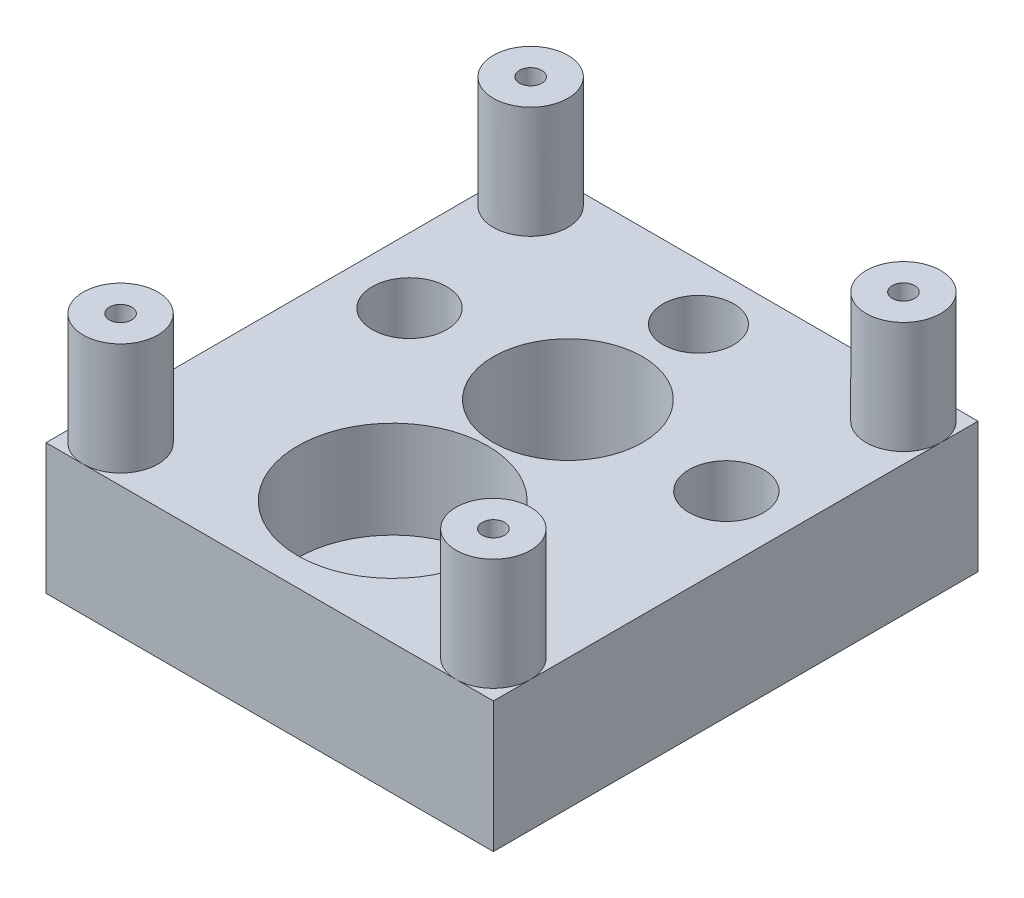
ISO-10303-21;
HEADER;
FILE_DESCRIPTION(('STEP AP214'),'2;1');
FILE_NAME('part.step','',(''),(''),'','','');
FILE_SCHEMA(('AUTOMOTIVE_DESIGN { 1 0 10303 214 1 1 1 1 }'));
ENDSEC;
DATA;
#1=APPLICATION_CONTEXT('core data for automotive mechanical design processes');
#2=APPLICATION_PROTOCOL_DEFINITION('international standard','automotive_design',2000,#1);
#3=PRODUCT_CONTEXT('',#1,'mechanical');
#4=PRODUCT('Part','Part','',(#3));
#5=PRODUCT_RELATED_PRODUCT_CATEGORY('part','',(#4));
#6=PRODUCT_DEFINITION_FORMATION('','',#4);
#7=PRODUCT_DEFINITION_CONTEXT('part definition',#1,'design');
#8=PRODUCT_DEFINITION('design','',#6,#7);
#9=PRODUCT_DEFINITION_SHAPE('','',#8);
#10=(LENGTH_UNIT() NAMED_UNIT(*) SI_UNIT(.MILLI.,.METRE.));
#11=(NAMED_UNIT(*) PLANE_ANGLE_UNIT() SI_UNIT($,.RADIAN.));
#12=(NAMED_UNIT(*) SI_UNIT($,.STERADIAN.) SOLID_ANGLE_UNIT());
#13=UNCERTAINTY_MEASURE_WITH_UNIT(LENGTH_MEASURE(1.E-05),#10,'distance_accuracy_value','');
#14=(GEOMETRIC_REPRESENTATION_CONTEXT(3) GLOBAL_UNCERTAINTY_ASSIGNED_CONTEXT((#13)) GLOBAL_UNIT_ASSIGNED_CONTEXT((#10,
#11,#12)) REPRESENTATION_CONTEXT('',''));
#15=CARTESIAN_POINT('',(0.,0.,0.));
#16=DIRECTION('',(0.,0.,1.));
#17=DIRECTION('',(1.,0.,0.));
#18=AXIS2_PLACEMENT_3D('',#15,#16,#17);
#19=CARTESIAN_POINT('',(0.,3.5,0.));
#20=DIRECTION('',(0.,1.,0.));
#21=DIRECTION('',(0.,0.,1.));
#22=AXIS2_PLACEMENT_3D('',#19,#20,#21);
#23=PLANE('',#22);
#24=CARTESIAN_POINT('',(0.,3.5,0.));
#25=DIRECTION('',(0.,1.,0.));
#26=DIRECTION('',(0.,0.,1.));
#27=AXIS2_PLACEMENT_3D('',#24,#25,#26);
#28=CIRCLE('',#27,2.);
#29=CARTESIAN_POINT('',(0.,3.5,2.));
#30=VERTEX_POINT('',#29);
#31=EDGE_CURVE('E204',#30,#30,#28,.T.);
#32=ORIENTED_EDGE('',*,*,#31,.F.);
#33=EDGE_LOOP('',(#32));
#34=FACE_BOUND('',#33,.T.);
#35=CARTESIAN_POINT('',(4.25,3.5,0.));
#36=DIRECTION('',(0.,1.,0.));
#37=DIRECTION('',(0.,0.,1.));
#38=AXIS2_PLACEMENT_3D('',#35,#36,#37);
#39=CIRCLE('',#38,1.);
#40=CARTESIAN_POINT('',(4.25,3.5,1.));
#41=VERTEX_POINT('',#40);
#42=EDGE_CURVE('E308',#41,#41,#39,.T.);
#43=ORIENTED_EDGE('',*,*,#42,.F.);
#44=EDGE_LOOP('',(#43));
#45=FACE_BOUND('',#44,.T.);
#46=CARTESIAN_POINT('',(0.,3.5,-3.5));
#47=DIRECTION('',(0.,1.,0.));
#48=DIRECTION('',(0.,0.,1.));
#49=AXIS2_PLACEMENT_3D('',#46,#47,#48);
#50=CIRCLE('',#49,0.95);
#51=CARTESIAN_POINT('',(0.,3.5,-2.55));
#52=VERTEX_POINT('',#51);
#53=EDGE_CURVE('E303',#52,#52,#50,.T.);
#54=ORIENTED_EDGE('',*,*,#53,.F.);
#55=EDGE_LOOP('',(#54));
#56=FACE_BOUND('',#55,.T.);
#57=CARTESIAN_POINT('',(-4.25,3.5,0.));
#58=DIRECTION('',(0.,1.,0.));
#59=DIRECTION('',(0.,0.,1.));
#60=AXIS2_PLACEMENT_3D('',#57,#58,#59);
#61=CIRCLE('',#60,1.);
#62=CARTESIAN_POINT('',(-4.25,3.5,1.));
#63=VERTEX_POINT('',#62);
#64=EDGE_CURVE('E300',#63,#63,#61,.T.);
#65=ORIENTED_EDGE('',*,*,#64,.F.);
#66=EDGE_LOOP('',(#65));
#67=FACE_BOUND('',#66,.T.);
#68=CARTESIAN_POINT('',(0.,3.5,4.7));
#69=DIRECTION('',(0.,1.,0.));
#70=DIRECTION('',(0.,0.,1.));
#71=AXIS2_PLACEMENT_3D('',#68,#69,#70);
#72=CIRCLE('',#71,2.55);
#73=CARTESIAN_POINT('',(0.,3.5,7.25));
#74=VERTEX_POINT('',#73);
#75=EDGE_CURVE('E291',#74,#74,#72,.T.);
#76=ORIENTED_EDGE('',*,*,#75,.F.);
#77=EDGE_LOOP('',(#76));
#78=FACE_BOUND('',#77,.T.);
#79=DIRECTION('',(1.,0.,0.));
#80=VECTOR('',#79,1.);
#81=CARTESIAN_POINT('',(-6.,3.5,8.));
#82=LINE('',#81,#80);
#83=CARTESIAN_POINT('',(-5.,3.5,8.));
#84=VERTEX_POINT('',#83);
#85=CARTESIAN_POINT('',(5.,3.5,8.));
#86=VERTEX_POINT('',#85);
#87=EDGE_CURVE('E176',#84,#86,#82,.T.);
#88=ORIENTED_EDGE('',*,*,#87,.T.);
#89=CARTESIAN_POINT('',(5.,3.5,7.));
#90=DIRECTION('',(0.,1.,0.));
#91=DIRECTION('',(0.,0.,1.));
#92=AXIS2_PLACEMENT_3D('',#89,#90,#91);
#93=CIRCLE('',#92,1.);
#94=CARTESIAN_POINT('',(6.,3.5,7.));
#95=VERTEX_POINT('',#94);
#96=EDGE_CURVE('E112',#95,#86,#93,.T.);
#97=ORIENTED_EDGE('',*,*,#96,.F.);
#98=DIRECTION('',(0.,0.,1.));
#99=VECTOR('',#98,1.);
#100=CARTESIAN_POINT('',(6.,3.5,-5.));
#101=LINE('',#100,#99);
#102=CARTESIAN_POINT('',(6.,3.5,-4.));
#103=VERTEX_POINT('',#102);
#104=EDGE_CURVE('E172',#103,#95,#101,.T.);
#105=ORIENTED_EDGE('',*,*,#104,.F.);
#106=CARTESIAN_POINT('',(5.,3.5,-4.));
#107=DIRECTION('',(0.,1.,0.));
#108=DIRECTION('',(0.,0.,1.));
#109=AXIS2_PLACEMENT_3D('',#106,#107,#108);
#110=CIRCLE('',#109,1.);
#111=CARTESIAN_POINT('',(5.,3.5,-5.));
#112=VERTEX_POINT('',#111);
#113=EDGE_CURVE('E281',#112,#103,#110,.T.);
#114=ORIENTED_EDGE('',*,*,#113,.F.);
#115=DIRECTION('',(1.,0.,0.));
#116=VECTOR('',#115,1.);
#117=CARTESIAN_POINT('',(-6.,3.5,-5.));
#118=LINE('',#117,#116);
#119=CARTESIAN_POINT('',(-5.,3.5,-5.));
#120=VERTEX_POINT('',#119);
#121=EDGE_CURVE('E199',#120,#112,#118,.T.);
#122=ORIENTED_EDGE('',*,*,#121,.F.);
#123=CARTESIAN_POINT('',(-5.,3.5,-4.));
#124=DIRECTION('',(0.,1.,0.));
#125=DIRECTION('',(0.,0.,1.));
#126=AXIS2_PLACEMENT_3D('',#123,#124,#125);
#127=CIRCLE('',#126,1.);
#128=CARTESIAN_POINT('',(-6.,3.5,-4.));
#129=VERTEX_POINT('',#128);
#130=EDGE_CURVE('E671',#129,#120,#127,.T.);
#131=ORIENTED_EDGE('',*,*,#130,.F.);
#132=DIRECTION('',(0.,0.,1.));
#133=VECTOR('',#132,1.);
#134=CARTESIAN_POINT('',(-6.,3.5,-5.));
#135=LINE('',#134,#133);
#136=CARTESIAN_POINT('',(-6.,3.5,7.));
#137=VERTEX_POINT('',#136);
#138=EDGE_CURVE('E252',#129,#137,#135,.T.);
#139=ORIENTED_EDGE('',*,*,#138,.T.);
#140=CARTESIAN_POINT('',(-5.,3.5,7.));
#141=DIRECTION('',(0.,1.,0.));
#142=DIRECTION('',(0.,0.,1.));
#143=AXIS2_PLACEMENT_3D('',#140,#141,#142);
#144=CIRCLE('',#143,1.);
#145=EDGE_CURVE('E106',#84,#137,#144,.T.);
#146=ORIENTED_EDGE('',*,*,#145,.F.);
#147=EDGE_LOOP('',(#88,#97,#105,#114,#122,#131,#139,#146));
#148=FACE_BOUND('',#147,.T.);
#149=ADVANCED_FACE('F95',(#34,#45,#56,#67,#78,#148),#23,.T.);
#150=CARTESIAN_POINT('',(-6.,3.5,-5.));
#151=VERTEX_POINT('',#150);
#152=EDGE_CURVE('E250',#151,#129,#135,.T.);
#153=ORIENTED_EDGE('',*,*,#152,.T.);
#154=EDGE_CURVE('E119',#120,#129,#127,.T.);
#155=ORIENTED_EDGE('',*,*,#154,.F.);
#156=EDGE_CURVE('E195',#151,#120,#118,.T.);
#157=ORIENTED_EDGE('',*,*,#156,.F.);
#158=EDGE_LOOP('',(#153,#155,#157));
#159=FACE_BOUND('',#158,.T.);
#160=ADVANCED_FACE('F332',(#159),#23,.T.);
#161=CARTESIAN_POINT('',(6.,3.5,-5.));
#162=VERTEX_POINT('',#161);
#163=EDGE_CURVE('E191',#112,#162,#118,.T.);
#164=ORIENTED_EDGE('',*,*,#163,.F.);
#165=EDGE_CURVE('E279',#103,#112,#110,.T.);
#166=ORIENTED_EDGE('',*,*,#165,.F.);
#167=EDGE_CURVE('E186',#162,#103,#101,.T.);
#168=ORIENTED_EDGE('',*,*,#167,.F.);
#169=EDGE_LOOP('',(#164,#166,#168));
#170=FACE_BOUND('',#169,.T.);
#171=ADVANCED_FACE('F277',(#170),#23,.T.);
#172=CARTESIAN_POINT('',(6.,3.5,8.));
#173=VERTEX_POINT('',#172);
#174=EDGE_CURVE('E179',#95,#173,#101,.T.);
#175=ORIENTED_EDGE('',*,*,#174,.F.);
#176=EDGE_CURVE('E160',#86,#95,#93,.T.);
#177=ORIENTED_EDGE('',*,*,#176,.F.);
#178=EDGE_CURVE('E181',#86,#173,#82,.T.);
#179=ORIENTED_EDGE('',*,*,#178,.T.);
#180=EDGE_LOOP('',(#175,#177,#179));
#181=FACE_BOUND('',#180,.T.);
#182=ADVANCED_FACE('F180',(#181),#23,.T.);
#183=CARTESIAN_POINT('',(-4.25,3.5,0.));
#184=DIRECTION('',(0.,-1.,0.));
#185=DIRECTION('',(0.,0.,-1.));
#186=AXIS2_PLACEMENT_3D('',#183,#184,#185);
#187=CYLINDRICAL_SURFACE('',#186,0.8);
#188=CARTESIAN_POINT('',(-4.25,0.,0.));
#189=DIRECTION('',(0.,1.,0.));
#190=DIRECTION('',(0.,0.,1.));
#191=AXIS2_PLACEMENT_3D('',#188,#189,#190);
#192=CIRCLE('',#191,0.8);
#193=CARTESIAN_POINT('',(-4.25,0.,0.8));
#194=VERTEX_POINT('',#193);
#195=EDGE_CURVE('E238',#194,#194,#192,.T.);
#196=ORIENTED_EDGE('',*,*,#195,.F.);
#197=EDGE_LOOP('',(#196));
#198=FACE_BOUND('',#197,.T.);
#199=CARTESIAN_POINT('',(-4.25,2.,0.));
#200=DIRECTION('',(0.,1.,0.));
#201=DIRECTION('',(0.,0.,1.));
#202=AXIS2_PLACEMENT_3D('',#199,#200,#201);
#203=CIRCLE('',#202,0.8);
#204=CARTESIAN_POINT('',(-4.25,2.,0.8));
#205=VERTEX_POINT('',#204);
#206=EDGE_CURVE('E99',#205,#205,#203,.T.);
#207=ORIENTED_EDGE('',*,*,#206,.T.);
#208=EDGE_LOOP('',(#207));
#209=FACE_BOUND('',#208,.T.);
#210=ADVANCED_FACE('F352',(#198,#209),#187,.F.);
#211=CARTESIAN_POINT('',(4.25,3.5,0.));
#212=DIRECTION('',(0.,-1.,0.));
#213=DIRECTION('',(0.,0.,-1.));
#214=AXIS2_PLACEMENT_3D('',#211,#212,#213);
#215=CYLINDRICAL_SURFACE('',#214,0.800000000000001);
#216=CARTESIAN_POINT('',(4.25,0.,0.));
#217=DIRECTION('',(0.,1.,0.));
#218=DIRECTION('',(0.,0.,1.));
#219=AXIS2_PLACEMENT_3D('',#216,#217,#218);
#220=CIRCLE('',#219,0.800000000000001);
#221=CARTESIAN_POINT('',(4.25,0.,0.800000000000001));
#222=VERTEX_POINT('',#221);
#223=EDGE_CURVE('E233',#222,#222,#220,.T.);
#224=ORIENTED_EDGE('',*,*,#223,.F.);
#225=EDGE_LOOP('',(#224));
#226=FACE_BOUND('',#225,.T.);
#227=CARTESIAN_POINT('',(4.25,2.,0.));
#228=DIRECTION('',(0.,1.,0.));
#229=DIRECTION('',(0.,0.,1.));
#230=AXIS2_PLACEMENT_3D('',#227,#228,#229);
#231=CIRCLE('',#230,0.800000000000001);
#232=CARTESIAN_POINT('',(4.25,2.,0.800000000000001));
#233=VERTEX_POINT('',#232);
#234=EDGE_CURVE('E223',#233,#233,#231,.T.);
#235=ORIENTED_EDGE('',*,*,#234,.T.);
#236=EDGE_LOOP('',(#235));
#237=FACE_BOUND('',#236,.T.);
#238=ADVANCED_FACE('F348',(#226,#237),#215,.F.);
#239=CARTESIAN_POINT('',(0.,3.5,-3.5));
#240=DIRECTION('',(0.,-1.,0.));
#241=DIRECTION('',(0.,0.,-1.));
#242=AXIS2_PLACEMENT_3D('',#239,#240,#241);
#243=CYLINDRICAL_SURFACE('',#242,0.7);
#244=CARTESIAN_POINT('',(0.,0.,-3.5));
#245=DIRECTION('',(0.,1.,0.));
#246=DIRECTION('',(0.,0.,1.));
#247=AXIS2_PLACEMENT_3D('',#244,#245,#246);
#248=CIRCLE('',#247,0.7);
#249=CARTESIAN_POINT('',(0.,0.,-2.8));
#250=VERTEX_POINT('',#249);
#251=EDGE_CURVE('E229',#250,#250,#248,.T.);
#252=ORIENTED_EDGE('',*,*,#251,.F.);
#253=EDGE_LOOP('',(#252));
#254=FACE_BOUND('',#253,.T.);
#255=CARTESIAN_POINT('',(0.,2.,-3.5));
#256=DIRECTION('',(0.,1.,0.));
#257=DIRECTION('',(0.,0.,1.));
#258=AXIS2_PLACEMENT_3D('',#255,#256,#257);
#259=CIRCLE('',#258,0.7);
#260=CARTESIAN_POINT('',(0.,2.,-2.8));
#261=VERTEX_POINT('',#260);
#262=EDGE_CURVE('E221',#261,#261,#259,.T.);
#263=ORIENTED_EDGE('',*,*,#262,.T.);
#264=EDGE_LOOP('',(#263));
#265=FACE_BOUND('',#264,.T.);
#266=ADVANCED_FACE('F343',(#254,#265),#243,.F.);
#267=EDGE_CURVE('E12',#137,#84,#144,.T.);
#268=ORIENTED_EDGE('',*,*,#267,.F.);
#269=CARTESIAN_POINT('',(-6.,3.5,8.));
#270=VERTEX_POINT('',#269);
#271=EDGE_CURVE('E213',#137,#270,#135,.T.);
#272=ORIENTED_EDGE('',*,*,#271,.T.);
#273=EDGE_CURVE('E184',#270,#84,#82,.T.);
#274=ORIENTED_EDGE('',*,*,#273,.T.);
#275=EDGE_LOOP('',(#268,#272,#274));
#276=FACE_BOUND('',#275,.T.);
#277=ADVANCED_FACE('F260',(#276),#23,.T.);
#278=CARTESIAN_POINT('',(0.,0.,0.));
#279=DIRECTION('',(0.,1.,0.));
#280=DIRECTION('',(0.,0.,1.));
#281=AXIS2_PLACEMENT_3D('',#278,#279,#280);
#282=PLANE('',#281);
#283=DIRECTION('',(0.,0.,1.));
#284=VECTOR('',#283,1.);
#285=CARTESIAN_POINT('',(-6.,0.,-5.));
#286=LINE('',#285,#284);
#287=CARTESIAN_POINT('',(-6.,0.,-5.));
#288=VERTEX_POINT('',#287);
#289=CARTESIAN_POINT('',(-6.,0.,8.));
#290=VERTEX_POINT('',#289);
#291=EDGE_CURVE('E200',#288,#290,#286,.T.);
#292=ORIENTED_EDGE('',*,*,#291,.F.);
#293=DIRECTION('',(1.,0.,0.));
#294=VECTOR('',#293,1.);
#295=CARTESIAN_POINT('',(-6.,0.,-5.));
#296=LINE('',#295,#294);
#297=CARTESIAN_POINT('',(6.,0.,-5.));
#298=VERTEX_POINT('',#297);
#299=EDGE_CURVE('E210',#288,#298,#296,.T.);
#300=ORIENTED_EDGE('',*,*,#299,.T.);
#301=DIRECTION('',(0.,0.,1.));
#302=VECTOR('',#301,1.);
#303=CARTESIAN_POINT('',(6.,0.,-5.));
#304=LINE('',#303,#302);
#305=CARTESIAN_POINT('',(6.,0.,8.));
#306=VERTEX_POINT('',#305);
#307=EDGE_CURVE('E207',#298,#306,#304,.T.);
#308=ORIENTED_EDGE('',*,*,#307,.T.);
#309=DIRECTION('',(1.,0.,0.));
#310=VECTOR('',#309,1.);
#311=CARTESIAN_POINT('',(-6.,0.,8.));
#312=LINE('',#311,#310);
#313=EDGE_CURVE('E203',#290,#306,#312,.T.);
#314=ORIENTED_EDGE('',*,*,#313,.F.);
#315=EDGE_LOOP('',(#292,#300,#308,#314));
#316=FACE_BOUND('',#315,.T.);
#317=CARTESIAN_POINT('',(0.,0.,0.));
#318=DIRECTION('',(0.,1.,0.));
#319=DIRECTION('',(0.,0.,1.));
#320=AXIS2_PLACEMENT_3D('',#317,#318,#319);
#321=CIRCLE('',#320,2.);
#322=CARTESIAN_POINT('',(0.,0.,2.));
#323=VERTEX_POINT('',#322);
#324=EDGE_CURVE('E246',#323,#323,#321,.T.);
#325=ORIENTED_EDGE('',*,*,#324,.T.);
#326=EDGE_LOOP('',(#325));
#327=FACE_BOUND('',#326,.T.);
#328=ORIENTED_EDGE('',*,*,#195,.T.);
#329=EDGE_LOOP('',(#328));
#330=FACE_BOUND('',#329,.T.);
#331=ORIENTED_EDGE('',*,*,#223,.T.);
#332=EDGE_LOOP('',(#331));
#333=FACE_BOUND('',#332,.T.);
#334=ORIENTED_EDGE('',*,*,#251,.T.);
#335=EDGE_LOOP('',(#334));
#336=FACE_BOUND('',#335,.T.);
#337=ADVANCED_FACE('F270',(#316,#327,#330,#333,#336),#282,.F.);
#338=CARTESIAN_POINT('',(-6.,3.5,-5.));
#339=DIRECTION('',(1.,0.,0.));
#340=DIRECTION('',(0.,0.,-1.));
#341=AXIS2_PLACEMENT_3D('',#338,#339,#340);
#342=PLANE('',#341);
#343=ORIENTED_EDGE('',*,*,#291,.T.);
#344=DIRECTION('',(0.,-1.,0.));
#345=VECTOR('',#344,1.);
#346=CARTESIAN_POINT('',(-6.,3.5,8.));
#347=LINE('',#346,#345);
#348=EDGE_CURVE('E104',#270,#290,#347,.T.);
#349=ORIENTED_EDGE('',*,*,#348,.F.);
#350=ORIENTED_EDGE('',*,*,#271,.F.);
#351=ORIENTED_EDGE('',*,*,#138,.F.);
#352=ORIENTED_EDGE('',*,*,#152,.F.);
#353=DIRECTION('',(0.,-1.,0.));
#354=VECTOR('',#353,1.);
#355=CARTESIAN_POINT('',(-6.,3.5,-5.));
#356=LINE('',#355,#354);
#357=EDGE_CURVE('E198',#151,#288,#356,.T.);
#358=ORIENTED_EDGE('',*,*,#357,.T.);
#359=EDGE_LOOP('',(#343,#349,#350,#351,#352,#358));
#360=FACE_BOUND('',#359,.T.);
#361=ADVANCED_FACE('F97',(#360),#342,.F.);
#362=CARTESIAN_POINT('',(-6.,3.5,8.));
#363=DIRECTION('',(0.,0.,-1.));
#364=DIRECTION('',(-1.,0.,0.));
#365=AXIS2_PLACEMENT_3D('',#362,#363,#364);
#366=PLANE('',#365);
#367=ORIENTED_EDGE('',*,*,#313,.T.);
#368=DIRECTION('',(0.,-1.,0.));
#369=VECTOR('',#368,1.);
#370=CARTESIAN_POINT('',(6.,3.5,8.));
#371=LINE('',#370,#369);
#372=EDGE_CURVE('E217',#173,#306,#371,.T.);
#373=ORIENTED_EDGE('',*,*,#372,.F.);
#374=ORIENTED_EDGE('',*,*,#178,.F.);
#375=ORIENTED_EDGE('',*,*,#87,.F.);
#376=ORIENTED_EDGE('',*,*,#273,.F.);
#377=ORIENTED_EDGE('',*,*,#348,.T.);
#378=EDGE_LOOP('',(#367,#373,#374,#375,#376,#377));
#379=FACE_BOUND('',#378,.T.);
#380=ADVANCED_FACE('F266',(#379),#366,.F.);
#381=CARTESIAN_POINT('',(6.,3.5,-5.));
#382=DIRECTION('',(1.,0.,0.));
#383=DIRECTION('',(0.,0.,-1.));
#384=AXIS2_PLACEMENT_3D('',#381,#382,#383);
#385=PLANE('',#384);
#386=ORIENTED_EDGE('',*,*,#307,.F.);
#387=DIRECTION('',(0.,-1.,0.));
#388=VECTOR('',#387,1.);
#389=CARTESIAN_POINT('',(6.,3.5,-5.));
#390=LINE('',#389,#388);
#391=EDGE_CURVE('E215',#162,#298,#390,.T.);
#392=ORIENTED_EDGE('',*,*,#391,.F.);
#393=ORIENTED_EDGE('',*,*,#167,.T.);
#394=ORIENTED_EDGE('',*,*,#104,.T.);
#395=ORIENTED_EDGE('',*,*,#174,.T.);
#396=ORIENTED_EDGE('',*,*,#372,.T.);
#397=EDGE_LOOP('',(#386,#392,#393,#394,#395,#396));
#398=FACE_BOUND('',#397,.T.);
#399=ADVANCED_FACE('F188',(#398),#385,.T.);
#400=CARTESIAN_POINT('',(-6.,3.5,-5.));
#401=DIRECTION('',(0.,0.,-1.));
#402=DIRECTION('',(-1.,0.,0.));
#403=AXIS2_PLACEMENT_3D('',#400,#401,#402);
#404=PLANE('',#403);
#405=ORIENTED_EDGE('',*,*,#299,.F.);
#406=ORIENTED_EDGE('',*,*,#357,.F.);
#407=ORIENTED_EDGE('',*,*,#156,.T.);
#408=ORIENTED_EDGE('',*,*,#121,.T.);
#409=ORIENTED_EDGE('',*,*,#163,.T.);
#410=ORIENTED_EDGE('',*,*,#391,.T.);
#411=EDGE_LOOP('',(#405,#406,#407,#408,#409,#410));
#412=FACE_BOUND('',#411,.T.);
#413=ADVANCED_FACE('F273',(#412),#404,.T.);
#414=CARTESIAN_POINT('',(0.,3.5,0.));
#415=DIRECTION('',(0.,-1.,0.));
#416=DIRECTION('',(0.,0.,-1.));
#417=AXIS2_PLACEMENT_3D('',#414,#415,#416);
#418=CYLINDRICAL_SURFACE('',#417,2.);
#419=ORIENTED_EDGE('',*,*,#31,.T.);
#420=EDGE_LOOP('',(#419));
#421=FACE_BOUND('',#420,.T.);
#422=ORIENTED_EDGE('',*,*,#324,.F.);
#423=EDGE_LOOP('',(#422));
#424=FACE_BOUND('',#423,.T.);
#425=ADVANCED_FACE('F437',(#421,#424),#418,.F.);
#426=CARTESIAN_POINT('',(0.,2.,-3.5));
#427=DIRECTION('',(0.,1.,0.));
#428=DIRECTION('',(0.,0.,1.));
#429=AXIS2_PLACEMENT_3D('',#426,#427,#428);
#430=CYLINDRICAL_SURFACE('',#429,0.95);
#431=CARTESIAN_POINT('',(0.,2.,-3.5));
#432=DIRECTION('',(0.,1.,0.));
#433=DIRECTION('',(0.,0.,1.));
#434=AXIS2_PLACEMENT_3D('',#431,#432,#433);
#435=CIRCLE('',#434,0.95);
#436=CARTESIAN_POINT('',(0.,2.,-2.55));
#437=VERTEX_POINT('',#436);
#438=EDGE_CURVE('E306',#437,#437,#435,.T.);
#439=ORIENTED_EDGE('',*,*,#438,.F.);
#440=EDGE_LOOP('',(#439));
#441=FACE_BOUND('',#440,.T.);
#442=ORIENTED_EDGE('',*,*,#53,.T.);
#443=EDGE_LOOP('',(#442));
#444=FACE_BOUND('',#443,.T.);
#445=ADVANCED_FACE('F328',(#441,#444),#430,.F.);
#446=CARTESIAN_POINT('',(0.,2.,-3.5));
#447=DIRECTION('',(0.,1.,0.));
#448=DIRECTION('',(0.,0.,1.));
#449=AXIS2_PLACEMENT_3D('',#446,#447,#448);
#450=PLANE('',#449);
#451=ORIENTED_EDGE('',*,*,#262,.F.);
#452=EDGE_LOOP('',(#451));
#453=FACE_BOUND('',#452,.T.);
#454=ORIENTED_EDGE('',*,*,#438,.T.);
#455=EDGE_LOOP('',(#454));
#456=FACE_BOUND('',#455,.T.);
#457=ADVANCED_FACE('F319',(#453,#456),#450,.T.);
#458=CARTESIAN_POINT('',(4.25,2.,0.));
#459=DIRECTION('',(0.,1.,0.));
#460=DIRECTION('',(0.,0.,1.));
#461=AXIS2_PLACEMENT_3D('',#458,#459,#460);
#462=CYLINDRICAL_SURFACE('',#461,1.);
#463=CARTESIAN_POINT('',(4.25,2.,0.));
#464=DIRECTION('',(0.,1.,0.));
#465=DIRECTION('',(0.,0.,1.));
#466=AXIS2_PLACEMENT_3D('',#463,#464,#465);
#467=CIRCLE('',#466,1.);
#468=CARTESIAN_POINT('',(4.25,2.,1.));
#469=VERTEX_POINT('',#468);
#470=EDGE_CURVE('E241',#469,#469,#467,.T.);
#471=ORIENTED_EDGE('',*,*,#470,.F.);
#472=EDGE_LOOP('',(#471));
#473=FACE_BOUND('',#472,.T.);
#474=ORIENTED_EDGE('',*,*,#42,.T.);
#475=EDGE_LOOP('',(#474));
#476=FACE_BOUND('',#475,.T.);
#477=ADVANCED_FACE('F317',(#473,#476),#462,.F.);
#478=CARTESIAN_POINT('',(4.25,2.,0.));
#479=DIRECTION('',(0.,1.,0.));
#480=DIRECTION('',(0.,0.,1.));
#481=AXIS2_PLACEMENT_3D('',#478,#479,#480);
#482=PLANE('',#481);
#483=ORIENTED_EDGE('',*,*,#234,.F.);
#484=EDGE_LOOP('',(#483));
#485=FACE_BOUND('',#484,.T.);
#486=ORIENTED_EDGE('',*,*,#470,.T.);
#487=EDGE_LOOP('',(#486));
#488=FACE_BOUND('',#487,.T.);
#489=ADVANCED_FACE('F315',(#485,#488),#482,.T.);
#490=CARTESIAN_POINT('',(-4.25,2.,0.));
#491=DIRECTION('',(0.,1.,0.));
#492=DIRECTION('',(0.,0.,1.));
#493=AXIS2_PLACEMENT_3D('',#490,#491,#492);
#494=CYLINDRICAL_SURFACE('',#493,1.);
#495=CARTESIAN_POINT('',(-4.25,2.,0.));
#496=DIRECTION('',(0.,1.,0.));
#497=DIRECTION('',(0.,0.,1.));
#498=AXIS2_PLACEMENT_3D('',#495,#496,#497);
#499=CIRCLE('',#498,1.);
#500=CARTESIAN_POINT('',(-4.25,2.,1.));
#501=VERTEX_POINT('',#500);
#502=EDGE_CURVE('E224',#501,#501,#499,.T.);
#503=ORIENTED_EDGE('',*,*,#502,.F.);
#504=EDGE_LOOP('',(#503));
#505=FACE_BOUND('',#504,.T.);
#506=ORIENTED_EDGE('',*,*,#64,.T.);
#507=EDGE_LOOP('',(#506));
#508=FACE_BOUND('',#507,.T.);
#509=ADVANCED_FACE('F325',(#505,#508),#494,.F.);
#510=CARTESIAN_POINT('',(-4.25,2.,0.));
#511=DIRECTION('',(0.,1.,0.));
#512=DIRECTION('',(0.,0.,1.));
#513=AXIS2_PLACEMENT_3D('',#510,#511,#512);
#514=PLANE('',#513);
#515=ORIENTED_EDGE('',*,*,#206,.F.);
#516=EDGE_LOOP('',(#515));
#517=FACE_BOUND('',#516,.T.);
#518=ORIENTED_EDGE('',*,*,#502,.T.);
#519=EDGE_LOOP('',(#518));
#520=FACE_BOUND('',#519,.T.);
#521=ADVANCED_FACE('F393',(#517,#520),#514,.T.);
#522=CARTESIAN_POINT('',(0.,0.9,4.7));
#523=DIRECTION('',(0.,1.,0.));
#524=DIRECTION('',(0.,0.,1.));
#525=AXIS2_PLACEMENT_3D('',#522,#523,#524);
#526=CYLINDRICAL_SURFACE('',#525,2.55);
#527=CARTESIAN_POINT('',(0.,0.9,4.7));
#528=DIRECTION('',(0.,1.,0.));
#529=DIRECTION('',(0.,0.,1.));
#530=AXIS2_PLACEMENT_3D('',#527,#528,#529);
#531=CIRCLE('',#530,2.55);
#532=CARTESIAN_POINT('',(0.,0.9,7.25));
#533=VERTEX_POINT('',#532);
#534=EDGE_CURVE('E293',#533,#533,#531,.T.);
#535=ORIENTED_EDGE('',*,*,#534,.F.);
#536=EDGE_LOOP('',(#535));
#537=FACE_BOUND('',#536,.T.);
#538=ORIENTED_EDGE('',*,*,#75,.T.);
#539=EDGE_LOOP('',(#538));
#540=FACE_BOUND('',#539,.T.);
#541=ADVANCED_FACE('F381',(#537,#540),#526,.F.);
#542=CARTESIAN_POINT('',(0.,0.9,4.7));
#543=DIRECTION('',(0.,1.,0.));
#544=DIRECTION('',(0.,0.,1.));
#545=AXIS2_PLACEMENT_3D('',#542,#543,#544);
#546=PLANE('',#545);
#547=ORIENTED_EDGE('',*,*,#534,.T.);
#548=EDGE_LOOP('',(#547));
#549=FACE_BOUND('',#548,.T.);
#550=ADVANCED_FACE('F375',(#549),#546,.T.);
#551=CARTESIAN_POINT('',(-5.,6.5,7.));
#552=DIRECTION('',(0.,-1.,0.));
#553=DIRECTION('',(0.,0.,-1.));
#554=AXIS2_PLACEMENT_3D('',#551,#552,#553);
#555=CYLINDRICAL_SURFACE('',#554,1.);
#556=CARTESIAN_POINT('',(-5.,6.5,7.));
#557=DIRECTION('',(0.,1.,0.));
#558=DIRECTION('',(0.,0.,1.));
#559=AXIS2_PLACEMENT_3D('',#556,#557,#558);
#560=CIRCLE('',#559,1.);
#561=CARTESIAN_POINT('',(-5.,6.5,8.));
#562=VERTEX_POINT('',#561);
#563=EDGE_CURVE('E283',#562,#562,#560,.T.);
#564=ORIENTED_EDGE('',*,*,#563,.F.);
#565=EDGE_LOOP('',(#564));
#566=FACE_BOUND('',#565,.T.);
#567=ORIENTED_EDGE('',*,*,#145,.T.);
#568=ORIENTED_EDGE('',*,*,#267,.T.);
#569=EDGE_LOOP('',(#567,#568));
#570=FACE_BOUND('',#569,.T.);
#571=ADVANCED_FACE('F380',(#566,#570),#555,.T.);
#572=CARTESIAN_POINT('',(-5.,6.5,7.));
#573=DIRECTION('',(0.,1.,0.));
#574=DIRECTION('',(0.,0.,1.));
#575=AXIS2_PLACEMENT_3D('',#572,#573,#574);
#576=PLANE('',#575);
#577=CARTESIAN_POINT('',(-5.,6.5,7.));
#578=DIRECTION('',(0.,1.,0.));
#579=DIRECTION('',(0.,0.,1.));
#580=AXIS2_PLACEMENT_3D('',#577,#578,#579);
#581=CIRCLE('',#580,0.3);
#582=CARTESIAN_POINT('',(-5.,6.5,7.3));
#583=VERTEX_POINT('',#582);
#584=EDGE_CURVE('E661',#583,#583,#581,.T.);
#585=ORIENTED_EDGE('',*,*,#584,.F.);
#586=EDGE_LOOP('',(#585));
#587=FACE_BOUND('',#586,.T.);
#588=ORIENTED_EDGE('',*,*,#563,.T.);
#589=EDGE_LOOP('',(#588));
#590=FACE_BOUND('',#589,.T.);
#591=ADVANCED_FACE('F505',(#587,#590),#576,.T.);
#592=CARTESIAN_POINT('',(5.,6.5,-4.));
#593=DIRECTION('',(0.,-1.,0.));
#594=DIRECTION('',(0.,0.,-1.));
#595=AXIS2_PLACEMENT_3D('',#592,#593,#594);
#596=CYLINDRICAL_SURFACE('',#595,1.);
#597=CARTESIAN_POINT('',(5.,6.5,-4.));
#598=DIRECTION('',(0.,1.,0.));
#599=DIRECTION('',(0.,0.,1.));
#600=AXIS2_PLACEMENT_3D('',#597,#598,#599);
#601=CIRCLE('',#600,1.);
#602=CARTESIAN_POINT('',(5.,6.5,-3.));
#603=VERTEX_POINT('',#602);
#604=EDGE_CURVE('E284',#603,#603,#601,.T.);
#605=ORIENTED_EDGE('',*,*,#604,.F.);
#606=EDGE_LOOP('',(#605));
#607=FACE_BOUND('',#606,.T.);
#608=ORIENTED_EDGE('',*,*,#165,.T.);
#609=ORIENTED_EDGE('',*,*,#113,.T.);
#610=EDGE_LOOP('',(#608,#609));
#611=FACE_BOUND('',#610,.T.);
#612=ADVANCED_FACE('F513',(#607,#611),#596,.T.);
#613=CARTESIAN_POINT('',(5.,6.5,-4.));
#614=DIRECTION('',(0.,1.,0.));
#615=DIRECTION('',(0.,0.,1.));
#616=AXIS2_PLACEMENT_3D('',#613,#614,#615);
#617=PLANE('',#616);
#618=CARTESIAN_POINT('',(5.,6.5,-4.));
#619=DIRECTION('',(0.,1.,0.));
#620=DIRECTION('',(0.,0.,1.));
#621=AXIS2_PLACEMENT_3D('',#618,#619,#620);
#622=CIRCLE('',#621,0.3);
#623=CARTESIAN_POINT('',(5.,6.5,-3.7));
#624=VERTEX_POINT('',#623);
#625=EDGE_CURVE('E666',#624,#624,#622,.T.);
#626=ORIENTED_EDGE('',*,*,#625,.F.);
#627=EDGE_LOOP('',(#626));
#628=FACE_BOUND('',#627,.T.);
#629=ORIENTED_EDGE('',*,*,#604,.T.);
#630=EDGE_LOOP('',(#629));
#631=FACE_BOUND('',#630,.T.);
#632=ADVANCED_FACE('F518',(#628,#631),#617,.T.);
#633=CARTESIAN_POINT('',(-5.,6.5,-4.));
#634=DIRECTION('',(0.,-1.,0.));
#635=DIRECTION('',(0.,0.,-1.));
#636=AXIS2_PLACEMENT_3D('',#633,#634,#635);
#637=CYLINDRICAL_SURFACE('',#636,1.);
#638=CARTESIAN_POINT('',(-5.,6.5,-4.));
#639=DIRECTION('',(0.,1.,0.));
#640=DIRECTION('',(0.,0.,1.));
#641=AXIS2_PLACEMENT_3D('',#638,#639,#640);
#642=CIRCLE('',#641,1.);
#643=CARTESIAN_POINT('',(-5.,6.5,-3.));
#644=VERTEX_POINT('',#643);
#645=EDGE_CURVE('E165',#644,#644,#642,.T.);
#646=ORIENTED_EDGE('',*,*,#645,.F.);
#647=EDGE_LOOP('',(#646));
#648=FACE_BOUND('',#647,.T.);
#649=ORIENTED_EDGE('',*,*,#154,.T.);
#650=ORIENTED_EDGE('',*,*,#130,.T.);
#651=EDGE_LOOP('',(#649,#650));
#652=FACE_BOUND('',#651,.T.);
#653=ADVANCED_FACE('F526',(#648,#652),#637,.T.);
#654=CARTESIAN_POINT('',(-5.,6.5,-4.));
#655=DIRECTION('',(0.,1.,0.));
#656=DIRECTION('',(0.,0.,1.));
#657=AXIS2_PLACEMENT_3D('',#654,#655,#656);
#658=PLANE('',#657);
#659=CARTESIAN_POINT('',(-5.,6.5,-4.));
#660=DIRECTION('',(0.,1.,0.));
#661=DIRECTION('',(0.,0.,1.));
#662=AXIS2_PLACEMENT_3D('',#659,#660,#661);
#663=CIRCLE('',#662,0.3);
#664=CARTESIAN_POINT('',(-5.,6.5,-3.7));
#665=VERTEX_POINT('',#664);
#666=EDGE_CURVE('E684',#665,#665,#663,.T.);
#667=ORIENTED_EDGE('',*,*,#666,.F.);
#668=EDGE_LOOP('',(#667));
#669=FACE_BOUND('',#668,.T.);
#670=ORIENTED_EDGE('',*,*,#645,.T.);
#671=EDGE_LOOP('',(#670));
#672=FACE_BOUND('',#671,.T.);
#673=ADVANCED_FACE('F531',(#669,#672),#658,.T.);
#674=CARTESIAN_POINT('',(5.,6.5,7.));
#675=DIRECTION('',(0.,-1.,0.));
#676=DIRECTION('',(0.,0.,-1.));
#677=AXIS2_PLACEMENT_3D('',#674,#675,#676);
#678=CYLINDRICAL_SURFACE('',#677,1.);
#679=CARTESIAN_POINT('',(5.,6.5,7.));
#680=DIRECTION('',(0.,1.,0.));
#681=DIRECTION('',(0.,0.,1.));
#682=AXIS2_PLACEMENT_3D('',#679,#680,#681);
#683=CIRCLE('',#682,1.);
#684=CARTESIAN_POINT('',(5.,6.5,8.));
#685=VERTEX_POINT('',#684);
#686=EDGE_CURVE('E177',#685,#685,#683,.T.);
#687=ORIENTED_EDGE('',*,*,#686,.F.);
#688=EDGE_LOOP('',(#687));
#689=FACE_BOUND('',#688,.T.);
#690=ORIENTED_EDGE('',*,*,#176,.T.);
#691=ORIENTED_EDGE('',*,*,#96,.T.);
#692=EDGE_LOOP('',(#690,#691));
#693=FACE_BOUND('',#692,.T.);
#694=ADVANCED_FACE('F161',(#689,#693),#678,.T.);
#695=CARTESIAN_POINT('',(5.,6.5,7.));
#696=DIRECTION('',(0.,1.,0.));
#697=DIRECTION('',(0.,0.,1.));
#698=AXIS2_PLACEMENT_3D('',#695,#696,#697);
#699=PLANE('',#698);
#700=CARTESIAN_POINT('',(5.,6.5,7.));
#701=DIRECTION('',(0.,1.,0.));
#702=DIRECTION('',(0.,0.,1.));
#703=AXIS2_PLACEMENT_3D('',#700,#701,#702);
#704=CIRCLE('',#703,0.3);
#705=CARTESIAN_POINT('',(5.,6.5,7.3));
#706=VERTEX_POINT('',#705);
#707=EDGE_CURVE('E678',#706,#706,#704,.T.);
#708=ORIENTED_EDGE('',*,*,#707,.F.);
#709=EDGE_LOOP('',(#708));
#710=FACE_BOUND('',#709,.T.);
#711=ORIENTED_EDGE('',*,*,#686,.T.);
#712=EDGE_LOOP('',(#711));
#713=FACE_BOUND('',#712,.T.);
#714=ADVANCED_FACE('F543',(#710,#713),#699,.T.);
#715=CARTESIAN_POINT('',(5.,4.5,7.));
#716=DIRECTION('',(0.,1.,0.));
#717=DIRECTION('',(0.,0.,1.));
#718=AXIS2_PLACEMENT_3D('',#715,#716,#717);
#719=CYLINDRICAL_SURFACE('',#718,0.3);
#720=CARTESIAN_POINT('',(5.,4.5,7.));
#721=DIRECTION('',(0.,1.,0.));
#722=DIRECTION('',(0.,0.,1.));
#723=AXIS2_PLACEMENT_3D('',#720,#721,#722);
#724=CIRCLE('',#723,0.3);
#725=CARTESIAN_POINT('',(5.,4.5,7.3));
#726=VERTEX_POINT('',#725);
#727=EDGE_CURVE('E669',#726,#726,#724,.T.);
#728=ORIENTED_EDGE('',*,*,#727,.F.);
#729=EDGE_LOOP('',(#728));
#730=FACE_BOUND('',#729,.T.);
#731=ORIENTED_EDGE('',*,*,#707,.T.);
#732=EDGE_LOOP('',(#731));
#733=FACE_BOUND('',#732,.T.);
#734=ADVANCED_FACE('F574',(#730,#733),#719,.F.);
#735=CARTESIAN_POINT('',(5.,4.5,7.));
#736=DIRECTION('',(0.,1.,0.));
#737=DIRECTION('',(0.,0.,1.));
#738=AXIS2_PLACEMENT_3D('',#735,#736,#737);
#739=PLANE('',#738);
#740=ORIENTED_EDGE('',*,*,#727,.T.);
#741=EDGE_LOOP('',(#740));
#742=FACE_BOUND('',#741,.T.);
#743=ADVANCED_FACE('F584',(#742),#739,.T.);
#744=CARTESIAN_POINT('',(-5.,4.5,-4.));
#745=DIRECTION('',(0.,1.,0.));
#746=DIRECTION('',(0.,0.,1.));
#747=AXIS2_PLACEMENT_3D('',#744,#745,#746);
#748=CYLINDRICAL_SURFACE('',#747,0.3);
#749=CARTESIAN_POINT('',(-5.,4.5,-4.));
#750=DIRECTION('',(0.,1.,0.));
#751=DIRECTION('',(0.,0.,1.));
#752=AXIS2_PLACEMENT_3D('',#749,#750,#751);
#753=CIRCLE('',#752,0.3);
#754=CARTESIAN_POINT('',(-5.,4.5,-3.7));
#755=VERTEX_POINT('',#754);
#756=EDGE_CURVE('E681',#755,#755,#753,.T.);
#757=ORIENTED_EDGE('',*,*,#756,.F.);
#758=EDGE_LOOP('',(#757));
#759=FACE_BOUND('',#758,.T.);
#760=ORIENTED_EDGE('',*,*,#666,.T.);
#761=EDGE_LOOP('',(#760));
#762=FACE_BOUND('',#761,.T.);
#763=ADVANCED_FACE('F594',(#759,#762),#748,.F.);
#764=CARTESIAN_POINT('',(-5.,4.5,-4.));
#765=DIRECTION('',(0.,1.,0.));
#766=DIRECTION('',(0.,0.,1.));
#767=AXIS2_PLACEMENT_3D('',#764,#765,#766);
#768=PLANE('',#767);
#769=ORIENTED_EDGE('',*,*,#756,.T.);
#770=EDGE_LOOP('',(#769));
#771=FACE_BOUND('',#770,.T.);
#772=ADVANCED_FACE('F604',(#771),#768,.T.);
#773=CARTESIAN_POINT('',(5.,4.5,-4.));
#774=DIRECTION('',(0.,1.,0.));
#775=DIRECTION('',(0.,0.,1.));
#776=AXIS2_PLACEMENT_3D('',#773,#774,#775);
#777=CYLINDRICAL_SURFACE('',#776,0.3);
#778=CARTESIAN_POINT('',(5.,4.5,-4.));
#779=DIRECTION('',(0.,1.,0.));
#780=DIRECTION('',(0.,0.,1.));
#781=AXIS2_PLACEMENT_3D('',#778,#779,#780);
#782=CIRCLE('',#781,0.3);
#783=CARTESIAN_POINT('',(5.,4.5,-3.7));
#784=VERTEX_POINT('',#783);
#785=EDGE_CURVE('E687',#784,#784,#782,.T.);
#786=ORIENTED_EDGE('',*,*,#785,.F.);
#787=EDGE_LOOP('',(#786));
#788=FACE_BOUND('',#787,.T.);
#789=ORIENTED_EDGE('',*,*,#625,.T.);
#790=EDGE_LOOP('',(#789));
#791=FACE_BOUND('',#790,.T.);
#792=ADVANCED_FACE('F614',(#788,#791),#777,.F.);
#793=CARTESIAN_POINT('',(5.,4.5,-4.));
#794=DIRECTION('',(0.,1.,0.));
#795=DIRECTION('',(0.,0.,1.));
#796=AXIS2_PLACEMENT_3D('',#793,#794,#795);
#797=PLANE('',#796);
#798=ORIENTED_EDGE('',*,*,#785,.T.);
#799=EDGE_LOOP('',(#798));
#800=FACE_BOUND('',#799,.T.);
#801=ADVANCED_FACE('F624',(#800),#797,.T.);
#802=CARTESIAN_POINT('',(-5.,4.5,7.));
#803=DIRECTION('',(0.,1.,0.));
#804=DIRECTION('',(0.,0.,1.));
#805=AXIS2_PLACEMENT_3D('',#802,#803,#804);
#806=CYLINDRICAL_SURFACE('',#805,0.3);
#807=CARTESIAN_POINT('',(-5.,4.5,7.));
#808=DIRECTION('',(0.,1.,0.));
#809=DIRECTION('',(0.,0.,1.));
#810=AXIS2_PLACEMENT_3D('',#807,#808,#809);
#811=CIRCLE('',#810,0.3);
#812=CARTESIAN_POINT('',(-5.,4.5,7.3));
#813=VERTEX_POINT('',#812);
#814=EDGE_CURVE('E660',#813,#813,#811,.T.);
#815=ORIENTED_EDGE('',*,*,#814,.F.);
#816=EDGE_LOOP('',(#815));
#817=FACE_BOUND('',#816,.T.);
#818=ORIENTED_EDGE('',*,*,#584,.T.);
#819=EDGE_LOOP('',(#818));
#820=FACE_BOUND('',#819,.T.);
#821=ADVANCED_FACE('F634',(#817,#820),#806,.F.);
#822=CARTESIAN_POINT('',(-5.,4.5,7.));
#823=DIRECTION('',(0.,1.,0.));
#824=DIRECTION('',(0.,0.,1.));
#825=AXIS2_PLACEMENT_3D('',#822,#823,#824);
#826=PLANE('',#825);
#827=ORIENTED_EDGE('',*,*,#814,.T.);
#828=EDGE_LOOP('',(#827));
#829=FACE_BOUND('',#828,.T.);
#830=ADVANCED_FACE('F644',(#829),#826,.T.);
#831=CLOSED_SHELL('',(#149,#160,#171,#182,#210,#238,#266,#277,#337,#361,#380,#399,#413,#425,
#445,#457,#477,#489,#509,#521,#541,#550,#571,#591,#612,#632,#653,#673,#694,#714,#734,#743,#763,
#772,#792,#801,#821,#830));
#832=MANIFOLD_SOLID_BREP('B2',#831);
#833=ADVANCED_BREP_SHAPE_REPRESENTATION('',(#18,#832),#14);
#834=SHAPE_DEFINITION_REPRESENTATION(#9,#833);
ENDSEC;
END-ISO-10303-21;
